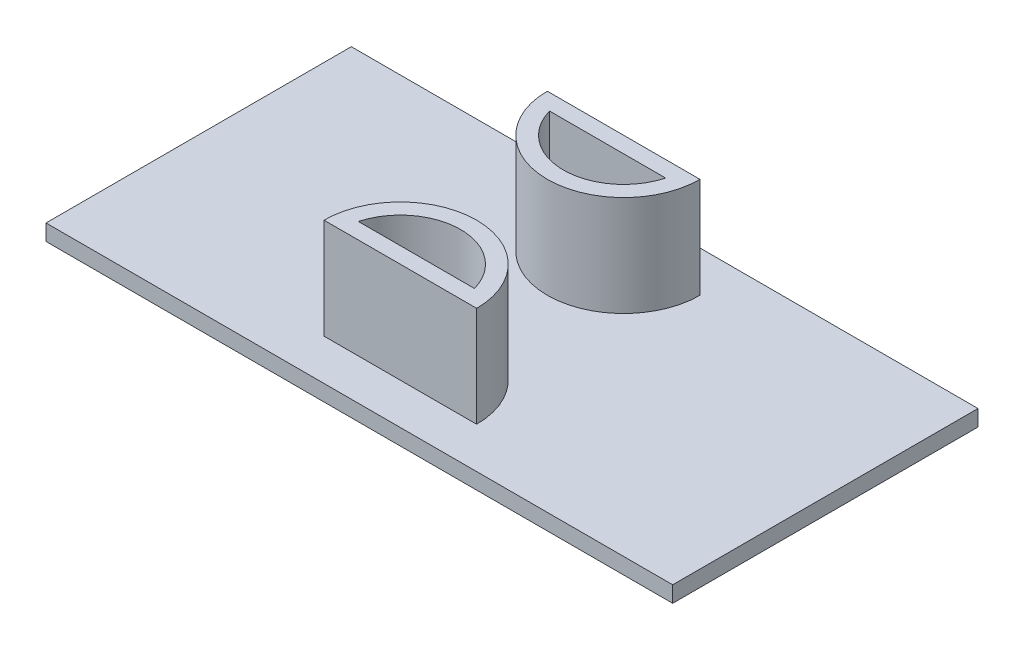
ISO-10303-21;
HEADER;
FILE_DESCRIPTION(('STEP AP214'),'2;1');
FILE_NAME('part.step','',(''),(''),'','','');
FILE_SCHEMA(('AUTOMOTIVE_DESIGN { 1 0 10303 214 1 1 1 1 }'));
ENDSEC;
DATA;
#1=APPLICATION_CONTEXT('core data for automotive mechanical design processes');
#2=APPLICATION_PROTOCOL_DEFINITION('international standard','automotive_design',2000,#1);
#3=PRODUCT_CONTEXT('',#1,'mechanical');
#4=PRODUCT('Part','Part','',(#3));
#5=PRODUCT_RELATED_PRODUCT_CATEGORY('part','',(#4));
#6=PRODUCT_DEFINITION_FORMATION('','',#4);
#7=PRODUCT_DEFINITION_CONTEXT('part definition',#1,'design');
#8=PRODUCT_DEFINITION('design','',#6,#7);
#9=PRODUCT_DEFINITION_SHAPE('','',#8);
#10=(LENGTH_UNIT() NAMED_UNIT(*) SI_UNIT(.MILLI.,.METRE.));
#11=(NAMED_UNIT(*) PLANE_ANGLE_UNIT() SI_UNIT($,.RADIAN.));
#12=(NAMED_UNIT(*) SI_UNIT($,.STERADIAN.) SOLID_ANGLE_UNIT());
#13=UNCERTAINTY_MEASURE_WITH_UNIT(LENGTH_MEASURE(1.E-05),#10,'distance_accuracy_value','');
#14=(GEOMETRIC_REPRESENTATION_CONTEXT(3) GLOBAL_UNCERTAINTY_ASSIGNED_CONTEXT((#13)) GLOBAL_UNIT_ASSIGNED_CONTEXT((#10,
#11,#12)) REPRESENTATION_CONTEXT('',''));
#15=CARTESIAN_POINT('',(0.,0.,0.));
#16=DIRECTION('',(0.,0.,1.));
#17=DIRECTION('',(1.,0.,0.));
#18=AXIS2_PLACEMENT_3D('',#15,#16,#17);
#19=CARTESIAN_POINT('',(0.,1.,0.));
#20=DIRECTION('',(0.,1.,0.));
#21=DIRECTION('',(0.,0.,1.));
#22=AXIS2_PLACEMENT_3D('',#19,#20,#21);
#23=PLANE('',#22);
#24=DIRECTION('',(-1.,0.,0.));
#25=VECTOR('',#24,1.);
#26=CARTESIAN_POINT('',(2.33157894736841,1.,-7.66184210526316));
#27=LINE('',#26,#25);
#28=CARTESIAN_POINT('',(11.8315789473684,1.,-7.66184210526316));
#29=VERTEX_POINT('',#28);
#30=CARTESIAN_POINT('',(2.33157894736841,1.,-7.66184210526316));
#31=VERTEX_POINT('',#30);
#32=EDGE_CURVE('E177',#29,#31,#27,.T.);
#33=ORIENTED_EDGE('',*,*,#32,.F.);
#34=CARTESIAN_POINT('',(7.08157894736841,1.,-7.66184210526316));
#35=DIRECTION('',(0.,1.,0.));
#36=DIRECTION('',(0.,0.,1.));
#37=AXIS2_PLACEMENT_3D('',#34,#35,#36);
#38=CIRCLE('',#37,4.75);
#39=EDGE_CURVE('E172',#31,#29,#38,.T.);
#40=ORIENTED_EDGE('',*,*,#39,.F.);
#41=EDGE_LOOP('',(#33,#40));
#42=FACE_BOUND('',#41,.T.);
#43=DIRECTION('',(0.,0.,1.));
#44=VECTOR('',#43,1.);
#45=CARTESIAN_POINT('',(-12.4184210526316,1.,-10.2118421052632));
#46=LINE('',#45,#44);
#47=CARTESIAN_POINT('',(-12.4184210526316,1.,-10.2118421052632));
#48=VERTEX_POINT('',#47);
#49=CARTESIAN_POINT('',(-12.4184210526316,1.,8.78815789473684));
#50=VERTEX_POINT('',#49);
#51=EDGE_CURVE('E188',#48,#50,#46,.T.);
#52=ORIENTED_EDGE('',*,*,#51,.T.);
#53=DIRECTION('',(1.,0.,0.));
#54=VECTOR('',#53,1.);
#55=CARTESIAN_POINT('',(-12.4184210526316,1.,8.78815789473684));
#56=LINE('',#55,#54);
#57=CARTESIAN_POINT('',(26.5815789473684,1.,8.78815789473684));
#58=VERTEX_POINT('',#57);
#59=EDGE_CURVE('E191',#50,#58,#56,.T.);
#60=ORIENTED_EDGE('',*,*,#59,.T.);
#61=DIRECTION('',(0.,0.,-1.));
#62=VECTOR('',#61,1.);
#63=CARTESIAN_POINT('',(26.5815789473684,1.,-10.2118421052632));
#64=LINE('',#63,#62);
#65=CARTESIAN_POINT('',(26.5815789473684,1.,-10.2118421052632));
#66=VERTEX_POINT('',#65);
#67=EDGE_CURVE('E194',#58,#66,#64,.T.);
#68=ORIENTED_EDGE('',*,*,#67,.T.);
#69=DIRECTION('',(-1.,0.,0.));
#70=VECTOR('',#69,1.);
#71=CARTESIAN_POINT('',(-12.4184210526316,1.,-10.2118421052632));
#72=LINE('',#71,#70);
#73=EDGE_CURVE('E196',#66,#48,#72,.T.);
#74=ORIENTED_EDGE('',*,*,#73,.T.);
#75=EDGE_LOOP('',(#52,#60,#68,#74));
#76=FACE_BOUND('',#75,.T.);
#77=DIRECTION('',(1.,0.,0.));
#78=VECTOR('',#77,1.);
#79=CARTESIAN_POINT('',(2.33157894736841,1.,6.23815789473684));
#80=LINE('',#79,#78);
#81=CARTESIAN_POINT('',(2.33157894736841,1.,6.23815789473684));
#82=VERTEX_POINT('',#81);
#83=CARTESIAN_POINT('',(11.8315789473684,1.,6.23815789473684));
#84=VERTEX_POINT('',#83);
#85=EDGE_CURVE('E149',#82,#84,#80,.T.);
#86=ORIENTED_EDGE('',*,*,#85,.F.);
#87=CARTESIAN_POINT('',(7.08157894736841,1.,6.23815789473684));
#88=DIRECTION('',(0.,1.,0.));
#89=DIRECTION('',(0.,0.,-1.));
#90=AXIS2_PLACEMENT_3D('',#87,#88,#89);
#91=CIRCLE('',#90,4.75);
#92=EDGE_CURVE('E48',#84,#82,#91,.T.);
#93=ORIENTED_EDGE('',*,*,#92,.F.);
#94=EDGE_LOOP('',(#86,#93));
#95=FACE_BOUND('',#94,.T.);
#96=ADVANCED_FACE('F33',(#42,#76,#95),#23,.T.);
#97=CARTESIAN_POINT('',(-12.4184210526316,1.,-10.2118421052632));
#98=DIRECTION('',(1.,0.,0.));
#99=DIRECTION('',(0.,0.,-1.));
#100=AXIS2_PLACEMENT_3D('',#97,#98,#99);
#101=PLANE('',#100);
#102=DIRECTION('',(0.,0.,1.));
#103=VECTOR('',#102,1.);
#104=CARTESIAN_POINT('',(-12.4184210526316,0.,-10.2118421052632));
#105=LINE('',#104,#103);
#106=CARTESIAN_POINT('',(-12.4184210526316,0.,-10.2118421052632));
#107=VERTEX_POINT('',#106);
#108=CARTESIAN_POINT('',(-12.4184210526316,0.,8.78815789473684));
#109=VERTEX_POINT('',#108);
#110=EDGE_CURVE('E187',#107,#109,#105,.T.);
#111=ORIENTED_EDGE('',*,*,#110,.T.);
#112=DIRECTION('',(0.,-1.,0.));
#113=VECTOR('',#112,1.);
#114=CARTESIAN_POINT('',(-12.4184210526316,1.,8.78815789473684));
#115=LINE('',#114,#113);
#116=EDGE_CURVE('E11',#50,#109,#115,.T.);
#117=ORIENTED_EDGE('',*,*,#116,.F.);
#118=ORIENTED_EDGE('',*,*,#51,.F.);
#119=DIRECTION('',(0.,-1.,0.));
#120=VECTOR('',#119,1.);
#121=CARTESIAN_POINT('',(-12.4184210526316,1.,-10.2118421052632));
#122=LINE('',#121,#120);
#123=EDGE_CURVE('E198',#48,#107,#122,.T.);
#124=ORIENTED_EDGE('',*,*,#123,.T.);
#125=EDGE_LOOP('',(#111,#117,#118,#124));
#126=FACE_BOUND('',#125,.T.);
#127=ADVANCED_FACE('F35',(#126),#101,.F.);
#128=CARTESIAN_POINT('',(-12.4184210526316,1.,8.78815789473684));
#129=DIRECTION('',(0.,0.,-1.));
#130=DIRECTION('',(-1.,0.,0.));
#131=AXIS2_PLACEMENT_3D('',#128,#129,#130);
#132=PLANE('',#131);
#133=DIRECTION('',(1.,0.,0.));
#134=VECTOR('',#133,1.);
#135=CARTESIAN_POINT('',(-12.4184210526316,0.,8.78815789473684));
#136=LINE('',#135,#134);
#137=CARTESIAN_POINT('',(26.5815789473684,0.,8.78815789473684));
#138=VERTEX_POINT('',#137);
#139=EDGE_CURVE('E201',#109,#138,#136,.T.);
#140=ORIENTED_EDGE('',*,*,#139,.T.);
#141=DIRECTION('',(0.,-1.,0.));
#142=VECTOR('',#141,1.);
#143=CARTESIAN_POINT('',(26.5815789473684,1.,8.78815789473684));
#144=LINE('',#143,#142);
#145=EDGE_CURVE('E41',#58,#138,#144,.T.);
#146=ORIENTED_EDGE('',*,*,#145,.F.);
#147=ORIENTED_EDGE('',*,*,#59,.F.);
#148=ORIENTED_EDGE('',*,*,#116,.T.);
#149=EDGE_LOOP('',(#140,#146,#147,#148));
#150=FACE_BOUND('',#149,.T.);
#151=ADVANCED_FACE('F231',(#150),#132,.F.);
#152=CARTESIAN_POINT('',(26.5815789473684,1.,-10.2118421052632));
#153=DIRECTION('',(-1.,0.,0.));
#154=DIRECTION('',(0.,0.,1.));
#155=AXIS2_PLACEMENT_3D('',#152,#153,#154);
#156=PLANE('',#155);
#157=DIRECTION('',(0.,0.,-1.));
#158=VECTOR('',#157,1.);
#159=CARTESIAN_POINT('',(26.5815789473684,0.,-10.2118421052632));
#160=LINE('',#159,#158);
#161=CARTESIAN_POINT('',(26.5815789473684,0.,-10.2118421052632));
#162=VERTEX_POINT('',#161);
#163=EDGE_CURVE('E203',#138,#162,#160,.T.);
#164=ORIENTED_EDGE('',*,*,#163,.T.);
#165=DIRECTION('',(0.,-1.,0.));
#166=VECTOR('',#165,1.);
#167=CARTESIAN_POINT('',(26.5815789473684,1.,-10.2118421052632));
#168=LINE('',#167,#166);
#169=EDGE_CURVE('E208',#66,#162,#168,.T.);
#170=ORIENTED_EDGE('',*,*,#169,.F.);
#171=ORIENTED_EDGE('',*,*,#67,.F.);
#172=ORIENTED_EDGE('',*,*,#145,.T.);
#173=EDGE_LOOP('',(#164,#170,#171,#172));
#174=FACE_BOUND('',#173,.T.);
#175=ADVANCED_FACE('F215',(#174),#156,.F.);
#176=CARTESIAN_POINT('',(-12.4184210526316,1.,-10.2118421052632));
#177=DIRECTION('',(0.,0.,1.));
#178=DIRECTION('',(1.,0.,0.));
#179=AXIS2_PLACEMENT_3D('',#176,#177,#178);
#180=PLANE('',#179);
#181=DIRECTION('',(-1.,0.,0.));
#182=VECTOR('',#181,1.);
#183=CARTESIAN_POINT('',(-12.4184210526316,0.,-10.2118421052632));
#184=LINE('',#183,#182);
#185=EDGE_CURVE('E192',#162,#107,#184,.T.);
#186=ORIENTED_EDGE('',*,*,#185,.T.);
#187=ORIENTED_EDGE('',*,*,#123,.F.);
#188=ORIENTED_EDGE('',*,*,#73,.F.);
#189=ORIENTED_EDGE('',*,*,#169,.T.);
#190=EDGE_LOOP('',(#186,#187,#188,#189));
#191=FACE_BOUND('',#190,.T.);
#192=ADVANCED_FACE('F224',(#191),#180,.F.);
#193=CARTESIAN_POINT('',(0.,0.,0.));
#194=DIRECTION('',(0.,1.,0.));
#195=DIRECTION('',(0.,0.,1.));
#196=AXIS2_PLACEMENT_3D('',#193,#194,#195);
#197=PLANE('',#196);
#198=ORIENTED_EDGE('',*,*,#110,.F.);
#199=ORIENTED_EDGE('',*,*,#185,.F.);
#200=ORIENTED_EDGE('',*,*,#163,.F.);
#201=ORIENTED_EDGE('',*,*,#139,.F.);
#202=EDGE_LOOP('',(#198,#199,#200,#201));
#203=FACE_BOUND('',#202,.T.);
#204=ADVANCED_FACE('F221',(#203),#197,.F.);
#205=CARTESIAN_POINT('',(7.08157894736841,7.25,-7.66184210526316));
#206=DIRECTION('',(0.,1.,0.));
#207=DIRECTION('',(0.,0.,1.));
#208=AXIS2_PLACEMENT_3D('',#205,#206,#207);
#209=PLANE('',#208);
#210=CARTESIAN_POINT('',(7.08157894736841,7.25,-7.66184210526316));
#211=DIRECTION('',(0.,1.,0.));
#212=DIRECTION('',(0.,0.,1.));
#213=AXIS2_PLACEMENT_3D('',#210,#211,#212);
#214=CIRCLE('',#213,4.75);
#215=CARTESIAN_POINT('',(2.33157894736841,7.25,-7.66184210526316));
#216=VERTEX_POINT('',#215);
#217=CARTESIAN_POINT('',(11.8315789473684,7.25,-7.66184210526316));
#218=VERTEX_POINT('',#217);
#219=EDGE_CURVE('E173',#216,#218,#214,.T.);
#220=ORIENTED_EDGE('',*,*,#219,.T.);
#221=DIRECTION('',(-1.,0.,0.));
#222=VECTOR('',#221,1.);
#223=CARTESIAN_POINT('',(2.33157894736841,7.25,-7.66184210526316));
#224=LINE('',#223,#222);
#225=EDGE_CURVE('E176',#218,#216,#224,.T.);
#226=ORIENTED_EDGE('',*,*,#225,.T.);
#227=EDGE_LOOP('',(#220,#226));
#228=FACE_BOUND('',#227,.T.);
#229=DIRECTION('',(-1.,0.,0.));
#230=VECTOR('',#229,1.);
#231=CARTESIAN_POINT('',(3.46737087366817,7.25,-6.66184210526316));
#232=LINE('',#231,#230);
#233=CARTESIAN_POINT('',(10.6957870210687,7.25,-6.66184210526316));
#234=VERTEX_POINT('',#233);
#235=CARTESIAN_POINT('',(3.46737087366817,7.25,-6.66184210526316));
#236=VERTEX_POINT('',#235);
#237=EDGE_CURVE('E161',#234,#236,#232,.T.);
#238=ORIENTED_EDGE('',*,*,#237,.F.);
#239=CARTESIAN_POINT('',(7.08157894736841,7.25,-7.66184210526316));
#240=DIRECTION('',(0.,1.,0.));
#241=DIRECTION('',(0.,0.,1.));
#242=AXIS2_PLACEMENT_3D('',#239,#240,#241);
#243=CIRCLE('',#242,3.75);
#244=EDGE_CURVE('E158',#236,#234,#243,.T.);
#245=ORIENTED_EDGE('',*,*,#244,.F.);
#246=EDGE_LOOP('',(#238,#245));
#247=FACE_BOUND('',#246,.T.);
#248=ADVANCED_FACE('F269',(#228,#247),#209,.T.);
#249=CARTESIAN_POINT('',(7.08157894736841,7.25,-7.66184210526316));
#250=DIRECTION('',(0.,-1.,0.));
#251=DIRECTION('',(0.,0.,-1.));
#252=AXIS2_PLACEMENT_3D('',#249,#250,#251);
#253=CYLINDRICAL_SURFACE('',#252,4.75);
#254=ORIENTED_EDGE('',*,*,#39,.T.);
#255=DIRECTION('',(0.,-1.,0.));
#256=VECTOR('',#255,1.);
#257=CARTESIAN_POINT('',(11.8315789473684,7.25,-7.66184210526316));
#258=LINE('',#257,#256);
#259=EDGE_CURVE('E184',#218,#29,#258,.T.);
#260=ORIENTED_EDGE('',*,*,#259,.F.);
#261=ORIENTED_EDGE('',*,*,#219,.F.);
#262=DIRECTION('',(0.,-1.,0.));
#263=VECTOR('',#262,1.);
#264=CARTESIAN_POINT('',(2.33157894736841,7.25,-7.66184210526316));
#265=LINE('',#264,#263);
#266=EDGE_CURVE('E179',#216,#31,#265,.T.);
#267=ORIENTED_EDGE('',*,*,#266,.T.);
#268=EDGE_LOOP('',(#254,#260,#261,#267));
#269=FACE_BOUND('',#268,.T.);
#270=ADVANCED_FACE('F271',(#269),#253,.T.);
#271=CARTESIAN_POINT('',(2.33157894736841,7.25,-7.66184210526316));
#272=DIRECTION('',(0.,0.,1.));
#273=DIRECTION('',(1.,0.,0.));
#274=AXIS2_PLACEMENT_3D('',#271,#272,#273);
#275=PLANE('',#274);
#276=ORIENTED_EDGE('',*,*,#32,.T.);
#277=ORIENTED_EDGE('',*,*,#266,.F.);
#278=ORIENTED_EDGE('',*,*,#225,.F.);
#279=ORIENTED_EDGE('',*,*,#259,.T.);
#280=EDGE_LOOP('',(#276,#277,#278,#279));
#281=FACE_BOUND('',#280,.T.);
#282=ADVANCED_FACE('F278',(#281),#275,.F.);
#283=CARTESIAN_POINT('',(7.08157894736841,7.25,-7.66184210526316));
#284=DIRECTION('',(0.,-1.,0.));
#285=DIRECTION('',(0.,0.,-1.));
#286=AXIS2_PLACEMENT_3D('',#283,#284,#285);
#287=CYLINDRICAL_SURFACE('',#286,3.75);
#288=CARTESIAN_POINT('',(7.08157894736841,1.,-7.66184210526316));
#289=DIRECTION('',(0.,1.,0.));
#290=DIRECTION('',(0.,0.,1.));
#291=AXIS2_PLACEMENT_3D('',#288,#289,#290);
#292=CIRCLE('',#291,3.75);
#293=CARTESIAN_POINT('',(3.46737087366817,1.,-6.66184210526316));
#294=VERTEX_POINT('',#293);
#295=CARTESIAN_POINT('',(10.6957870210687,1.,-6.66184210526316));
#296=VERTEX_POINT('',#295);
#297=EDGE_CURVE('E157',#294,#296,#292,.T.);
#298=ORIENTED_EDGE('',*,*,#297,.F.);
#299=DIRECTION('',(0.,-1.,0.));
#300=VECTOR('',#299,1.);
#301=CARTESIAN_POINT('',(3.46737087366817,7.25,-6.66184210526316));
#302=LINE('',#301,#300);
#303=EDGE_CURVE('E164',#236,#294,#302,.T.);
#304=ORIENTED_EDGE('',*,*,#303,.F.);
#305=ORIENTED_EDGE('',*,*,#244,.T.);
#306=DIRECTION('',(0.,-1.,0.));
#307=VECTOR('',#306,1.);
#308=CARTESIAN_POINT('',(10.6957870210687,7.25,-6.66184210526316));
#309=LINE('',#308,#307);
#310=EDGE_CURVE('E169',#234,#296,#309,.T.);
#311=ORIENTED_EDGE('',*,*,#310,.T.);
#312=EDGE_LOOP('',(#298,#304,#305,#311));
#313=FACE_BOUND('',#312,.T.);
#314=ADVANCED_FACE('F259',(#313),#287,.F.);
#315=CARTESIAN_POINT('',(3.46737087366817,7.25,-6.66184210526316));
#316=DIRECTION('',(0.,0.,1.));
#317=DIRECTION('',(1.,0.,0.));
#318=AXIS2_PLACEMENT_3D('',#315,#316,#317);
#319=PLANE('',#318);
#320=DIRECTION('',(-1.,0.,0.));
#321=VECTOR('',#320,1.);
#322=CARTESIAN_POINT('',(3.46737087366817,1.,-6.66184210526316));
#323=LINE('',#322,#321);
#324=EDGE_CURVE('E162',#296,#294,#323,.T.);
#325=ORIENTED_EDGE('',*,*,#324,.F.);
#326=ORIENTED_EDGE('',*,*,#310,.F.);
#327=ORIENTED_EDGE('',*,*,#237,.T.);
#328=ORIENTED_EDGE('',*,*,#303,.T.);
#329=EDGE_LOOP('',(#325,#326,#327,#328));
#330=FACE_BOUND('',#329,.T.);
#331=ADVANCED_FACE('F250',(#330),#319,.T.);
#332=ORIENTED_EDGE('',*,*,#297,.T.);
#333=ORIENTED_EDGE('',*,*,#324,.T.);
#334=EDGE_LOOP('',(#332,#333));
#335=FACE_BOUND('',#334,.T.);
#336=ADVANCED_FACE('F242',(#335),#23,.T.);
#337=CARTESIAN_POINT('',(7.08157894736841,7.25,6.23815789473684));
#338=DIRECTION('',(0.,-1.,0.));
#339=DIRECTION('',(0.,0.,-1.));
#340=AXIS2_PLACEMENT_3D('',#337,#338,#339);
#341=PLANE('',#340);
#342=CARTESIAN_POINT('',(7.08157894736841,7.25,6.23815789473684));
#343=DIRECTION('',(0.,1.,0.));
#344=DIRECTION('',(0.,0.,-1.));
#345=AXIS2_PLACEMENT_3D('',#342,#343,#344);
#346=CIRCLE('',#345,4.75);
#347=CARTESIAN_POINT('',(11.8315789473684,7.25,6.23815789473684));
#348=VERTEX_POINT('',#347);
#349=CARTESIAN_POINT('',(2.33157894736841,7.25,6.23815789473684));
#350=VERTEX_POINT('',#349);
#351=EDGE_CURVE('E145',#348,#350,#346,.T.);
#352=ORIENTED_EDGE('',*,*,#351,.T.);
#353=DIRECTION('',(1.,0.,0.));
#354=VECTOR('',#353,1.);
#355=CARTESIAN_POINT('',(2.33157894736841,7.25,6.23815789473684));
#356=LINE('',#355,#354);
#357=EDGE_CURVE('E148',#350,#348,#356,.T.);
#358=ORIENTED_EDGE('',*,*,#357,.T.);
#359=EDGE_LOOP('',(#352,#358));
#360=FACE_BOUND('',#359,.T.);
#361=CARTESIAN_POINT('',(7.08157894736841,7.25,6.23815789473684));
#362=DIRECTION('',(0.,1.,0.));
#363=DIRECTION('',(0.,0.,-1.));
#364=AXIS2_PLACEMENT_3D('',#361,#362,#363);
#365=CIRCLE('',#364,3.75);
#366=CARTESIAN_POINT('',(10.6957870210687,7.25,5.23815789473684));
#367=VERTEX_POINT('',#366);
#368=CARTESIAN_POINT('',(3.46737087366817,7.25,5.23815789473684));
#369=VERTEX_POINT('',#368);
#370=EDGE_CURVE('E133',#367,#369,#365,.T.);
#371=ORIENTED_EDGE('',*,*,#370,.F.);
#372=DIRECTION('',(1.,0.,0.));
#373=VECTOR('',#372,1.);
#374=CARTESIAN_POINT('',(3.46737087366817,7.25,5.23815789473684));
#375=LINE('',#374,#373);
#376=EDGE_CURVE('E124',#369,#367,#375,.T.);
#377=ORIENTED_EDGE('',*,*,#376,.F.);
#378=EDGE_LOOP('',(#371,#377));
#379=FACE_BOUND('',#378,.T.);
#380=ADVANCED_FACE('F139',(#360,#379),#341,.F.);
#381=CARTESIAN_POINT('',(7.08157894736841,7.25,6.23815789473684));
#382=DIRECTION('',(0.,-1.,0.));
#383=DIRECTION('',(0.,0.,-1.));
#384=AXIS2_PLACEMENT_3D('',#381,#382,#383);
#385=CYLINDRICAL_SURFACE('',#384,4.75);
#386=ORIENTED_EDGE('',*,*,#92,.T.);
#387=DIRECTION('',(0.,-1.,0.));
#388=VECTOR('',#387,1.);
#389=CARTESIAN_POINT('',(2.33157894736841,7.25,6.23815789473684));
#390=LINE('',#389,#388);
#391=EDGE_CURVE('E155',#350,#82,#390,.T.);
#392=ORIENTED_EDGE('',*,*,#391,.F.);
#393=ORIENTED_EDGE('',*,*,#351,.F.);
#394=DIRECTION('',(0.,-1.,0.));
#395=VECTOR('',#394,1.);
#396=CARTESIAN_POINT('',(11.8315789473684,7.25,6.23815789473684));
#397=LINE('',#396,#395);
#398=EDGE_CURVE('E151',#348,#84,#397,.T.);
#399=ORIENTED_EDGE('',*,*,#398,.T.);
#400=EDGE_LOOP('',(#386,#392,#393,#399));
#401=FACE_BOUND('',#400,.T.);
#402=ADVANCED_FACE('F256',(#401),#385,.T.);
#403=CARTESIAN_POINT('',(2.33157894736841,7.25,6.23815789473684));
#404=DIRECTION('',(0.,0.,-1.));
#405=DIRECTION('',(-1.,0.,0.));
#406=AXIS2_PLACEMENT_3D('',#403,#404,#405);
#407=PLANE('',#406);
#408=ORIENTED_EDGE('',*,*,#85,.T.);
#409=ORIENTED_EDGE('',*,*,#398,.F.);
#410=ORIENTED_EDGE('',*,*,#357,.F.);
#411=ORIENTED_EDGE('',*,*,#391,.T.);
#412=EDGE_LOOP('',(#408,#409,#410,#411));
#413=FACE_BOUND('',#412,.T.);
#414=ADVANCED_FACE('F318',(#413),#407,.F.);
#415=CARTESIAN_POINT('',(7.08157894736841,7.25,6.23815789473684));
#416=DIRECTION('',(0.,-1.,0.));
#417=DIRECTION('',(0.,0.,-1.));
#418=AXIS2_PLACEMENT_3D('',#415,#416,#417);
#419=CYLINDRICAL_SURFACE('',#418,3.75);
#420=CARTESIAN_POINT('',(7.08157894736841,1.,6.23815789473684));
#421=DIRECTION('',(0.,1.,0.));
#422=DIRECTION('',(0.,0.,-1.));
#423=AXIS2_PLACEMENT_3D('',#420,#421,#422);
#424=CIRCLE('',#423,3.75);
#425=CARTESIAN_POINT('',(10.6957870210687,1.,5.23815789473684));
#426=VERTEX_POINT('',#425);
#427=CARTESIAN_POINT('',(3.46737087366817,1.,5.23815789473684));
#428=VERTEX_POINT('',#427);
#429=EDGE_CURVE('E137',#426,#428,#424,.T.);
#430=ORIENTED_EDGE('',*,*,#429,.F.);
#431=DIRECTION('',(0.,-1.,0.));
#432=VECTOR('',#431,1.);
#433=CARTESIAN_POINT('',(10.6957870210687,7.25,5.23815789473684));
#434=LINE('',#433,#432);
#435=EDGE_CURVE('E127',#367,#426,#434,.T.);
#436=ORIENTED_EDGE('',*,*,#435,.F.);
#437=ORIENTED_EDGE('',*,*,#370,.T.);
#438=DIRECTION('',(0.,-1.,0.));
#439=VECTOR('',#438,1.);
#440=CARTESIAN_POINT('',(3.46737087366817,7.25,5.23815789473684));
#441=LINE('',#440,#439);
#442=EDGE_CURVE('E129',#369,#428,#441,.T.);
#443=ORIENTED_EDGE('',*,*,#442,.T.);
#444=EDGE_LOOP('',(#430,#436,#437,#443));
#445=FACE_BOUND('',#444,.T.);
#446=ADVANCED_FACE('F136',(#445),#419,.F.);
#447=CARTESIAN_POINT('',(3.46737087366817,7.25,5.23815789473684));
#448=DIRECTION('',(0.,0.,-1.));
#449=DIRECTION('',(-1.,0.,0.));
#450=AXIS2_PLACEMENT_3D('',#447,#448,#449);
#451=PLANE('',#450);
#452=DIRECTION('',(1.,0.,0.));
#453=VECTOR('',#452,1.);
#454=CARTESIAN_POINT('',(3.46737087366817,1.,5.23815789473684));
#455=LINE('',#454,#453);
#456=EDGE_CURVE('E55',#428,#426,#455,.T.);
#457=ORIENTED_EDGE('',*,*,#456,.F.);
#458=ORIENTED_EDGE('',*,*,#442,.F.);
#459=ORIENTED_EDGE('',*,*,#376,.T.);
#460=ORIENTED_EDGE('',*,*,#435,.T.);
#461=EDGE_LOOP('',(#457,#458,#459,#460));
#462=FACE_BOUND('',#461,.T.);
#463=ADVANCED_FACE('F126',(#462),#451,.T.);
#464=ORIENTED_EDGE('',*,*,#429,.T.);
#465=ORIENTED_EDGE('',*,*,#456,.T.);
#466=EDGE_LOOP('',(#464,#465));
#467=FACE_BOUND('',#466,.T.);
#468=ADVANCED_FACE('F241',(#467),#23,.T.);
#469=CLOSED_SHELL('',(#96,#127,#151,#175,#192,#204,#248,#270,#282,#314,#331,#336,#380,#402,#414,
#446,#463,#468));
#470=MANIFOLD_SOLID_BREP('B2',#469);
#471=ADVANCED_BREP_SHAPE_REPRESENTATION('',(#18,#470),#14);
#472=SHAPE_DEFINITION_REPRESENTATION(#9,#471);
ENDSEC;
END-ISO-10303-21;
